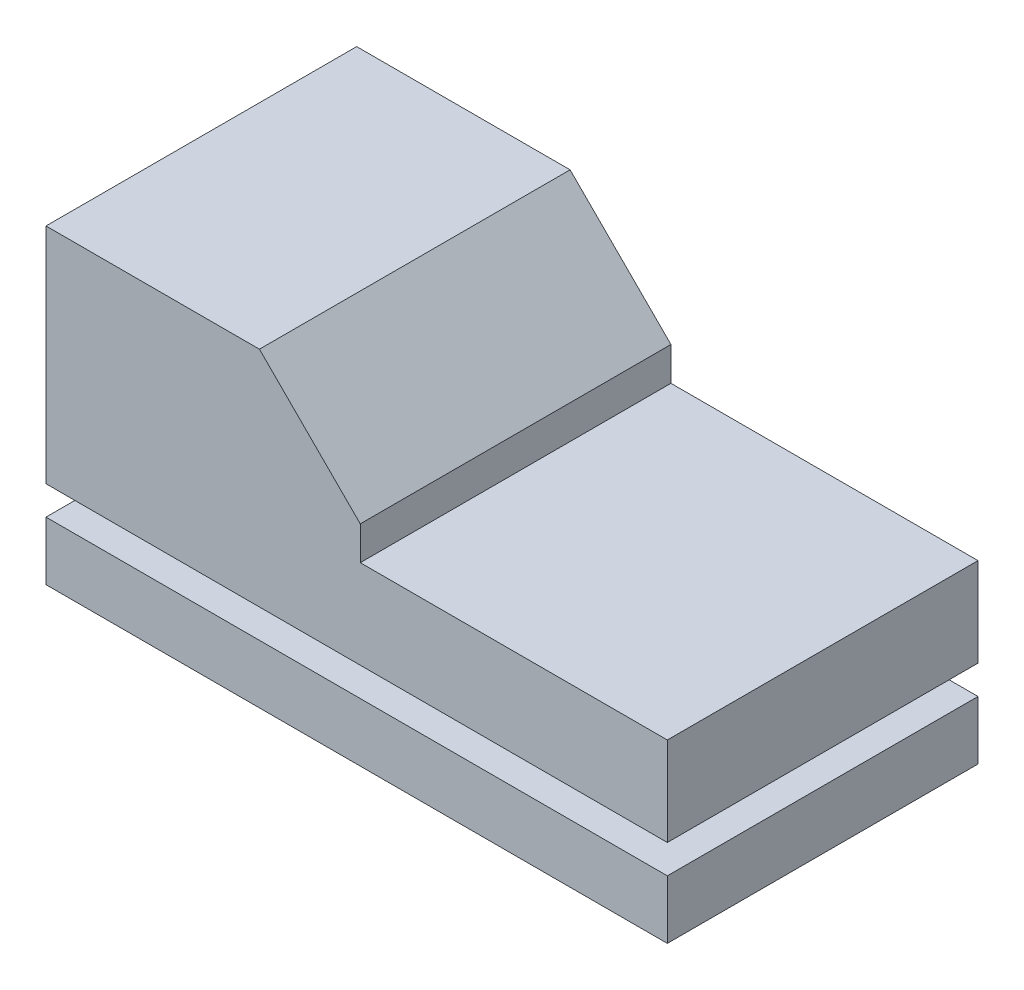
ISO-10303-21;
HEADER;
FILE_DESCRIPTION(('STEP AP214'),'2;1');
FILE_NAME('part.step','',(''),(''),'','','');
FILE_SCHEMA(('AUTOMOTIVE_DESIGN { 1 0 10303 214 1 1 1 1 }'));
ENDSEC;
DATA;
#1=APPLICATION_CONTEXT('core data for automotive mechanical design processes');
#2=APPLICATION_PROTOCOL_DEFINITION('international standard','automotive_design',2000,#1);
#3=PRODUCT_CONTEXT('',#1,'mechanical');
#4=PRODUCT('Part','Part','',(#3));
#5=PRODUCT_RELATED_PRODUCT_CATEGORY('part','',(#4));
#6=PRODUCT_DEFINITION_FORMATION('','',#4);
#7=PRODUCT_DEFINITION_CONTEXT('part definition',#1,'design');
#8=PRODUCT_DEFINITION('design','',#6,#7);
#9=PRODUCT_DEFINITION_SHAPE('','',#8);
#10=(LENGTH_UNIT() NAMED_UNIT(*) SI_UNIT(.MILLI.,.METRE.));
#11=(NAMED_UNIT(*) PLANE_ANGLE_UNIT() SI_UNIT($,.RADIAN.));
#12=(NAMED_UNIT(*) SI_UNIT($,.STERADIAN.) SOLID_ANGLE_UNIT());
#13=UNCERTAINTY_MEASURE_WITH_UNIT(LENGTH_MEASURE(1.E-05),#10,'distance_accuracy_value','');
#14=(GEOMETRIC_REPRESENTATION_CONTEXT(3) GLOBAL_UNCERTAINTY_ASSIGNED_CONTEXT((#13)) GLOBAL_UNIT_ASSIGNED_CONTEXT((#10,
#11,#12)) REPRESENTATION_CONTEXT('',''));
#15=CARTESIAN_POINT('',(0.,0.,0.));
#16=DIRECTION('',(0.,0.,1.));
#17=DIRECTION('',(1.,0.,0.));
#18=AXIS2_PLACEMENT_3D('',#15,#16,#17);
#19=CARTESIAN_POINT('',(101.6,28.81,25.4));
#20=DIRECTION('',(-1.,0.,0.));
#21=DIRECTION('',(0.,0.,1.));
#22=AXIS2_PLACEMENT_3D('',#19,#20,#21);
#23=PLANE('',#22);
#24=DIRECTION('',(0.,1.,0.));
#25=VECTOR('',#24,1.);
#26=CARTESIAN_POINT('',(101.6,28.81,25.4));
#27=LINE('',#26,#25);
#28=CARTESIAN_POINT('',(101.6,14.29,25.4));
#29=VERTEX_POINT('',#28);
#30=CARTESIAN_POINT('',(101.6,28.81,25.4));
#31=VERTEX_POINT('',#30);
#32=EDGE_CURVE('E255',#29,#31,#27,.T.);
#33=ORIENTED_EDGE('',*,*,#32,.F.);
#34=DIRECTION('',(0.,0.,1.));
#35=VECTOR('',#34,1.);
#36=CARTESIAN_POINT('',(101.6,14.29,-25.4));
#37=LINE('',#36,#35);
#38=CARTESIAN_POINT('',(101.6,14.29,-25.4));
#39=VERTEX_POINT('',#38);
#40=EDGE_CURVE('E240',#39,#29,#37,.T.);
#41=ORIENTED_EDGE('',*,*,#40,.F.);
#42=DIRECTION('',(0.,1.,0.));
#43=VECTOR('',#42,1.);
#44=CARTESIAN_POINT('',(101.6,28.81,-25.4));
#45=LINE('',#44,#43);
#46=CARTESIAN_POINT('',(101.6,28.81,-25.4));
#47=VERTEX_POINT('',#46);
#48=EDGE_CURVE('E275',#39,#47,#45,.T.);
#49=ORIENTED_EDGE('',*,*,#48,.T.);
#50=DIRECTION('',(0.,0.,-1.));
#51=VECTOR('',#50,1.);
#52=CARTESIAN_POINT('',(101.6,28.81,25.4));
#53=LINE('',#52,#51);
#54=EDGE_CURVE('E41',#31,#47,#53,.T.);
#55=ORIENTED_EDGE('',*,*,#54,.F.);
#56=EDGE_LOOP('',(#33,#41,#49,#55));
#57=FACE_BOUND('',#56,.T.);
#58=ADVANCED_FACE('F33',(#57),#23,.F.);
#59=CARTESIAN_POINT('',(51.39,28.81,25.4));
#60=DIRECTION('',(0.,-1.,0.));
#61=DIRECTION('',(1.,0.,0.));
#62=AXIS2_PLACEMENT_3D('',#59,#60,#61);
#63=PLANE('',#62);
#64=DIRECTION('',(-1.,0.,0.));
#65=VECTOR('',#64,1.);
#66=CARTESIAN_POINT('',(51.39,28.81,-25.4));
#67=LINE('',#66,#65);
#68=CARTESIAN_POINT('',(51.39,28.81,-25.4));
#69=VERTEX_POINT('',#68);
#70=EDGE_CURVE('E279',#47,#69,#67,.T.);
#71=ORIENTED_EDGE('',*,*,#70,.T.);
#72=DIRECTION('',(0.,0.,-1.));
#73=VECTOR('',#72,1.);
#74=CARTESIAN_POINT('',(51.39,28.81,25.4));
#75=LINE('',#74,#73);
#76=CARTESIAN_POINT('',(51.39,28.81,25.4));
#77=VERTEX_POINT('',#76);
#78=EDGE_CURVE('E301',#77,#69,#75,.T.);
#79=ORIENTED_EDGE('',*,*,#78,.F.);
#80=DIRECTION('',(-1.,0.,0.));
#81=VECTOR('',#80,1.);
#82=CARTESIAN_POINT('',(51.39,28.81,25.4));
#83=LINE('',#82,#81);
#84=EDGE_CURVE('E260',#31,#77,#83,.T.);
#85=ORIENTED_EDGE('',*,*,#84,.F.);
#86=ORIENTED_EDGE('',*,*,#54,.T.);
#87=EDGE_LOOP('',(#71,#79,#85,#86));
#88=FACE_BOUND('',#87,.T.);
#89=ADVANCED_FACE('F308',(#88),#63,.F.);
#90=CARTESIAN_POINT('',(51.39,34.31,25.4));
#91=DIRECTION('',(-1.,0.,0.));
#92=DIRECTION('',(0.,0.,1.));
#93=AXIS2_PLACEMENT_3D('',#90,#91,#92);
#94=PLANE('',#93);
#95=DIRECTION('',(0.,1.,0.));
#96=VECTOR('',#95,1.);
#97=CARTESIAN_POINT('',(51.39,34.31,-25.4));
#98=LINE('',#97,#96);
#99=CARTESIAN_POINT('',(51.39,34.31,-25.4));
#100=VERTEX_POINT('',#99);
#101=EDGE_CURVE('E281',#69,#100,#98,.T.);
#102=ORIENTED_EDGE('',*,*,#101,.T.);
#103=DIRECTION('',(0.,0.,-1.));
#104=VECTOR('',#103,1.);
#105=CARTESIAN_POINT('',(51.39,34.31,25.4));
#106=LINE('',#105,#104);
#107=CARTESIAN_POINT('',(51.39,34.31,25.4));
#108=VERTEX_POINT('',#107);
#109=EDGE_CURVE('E298',#108,#100,#106,.T.);
#110=ORIENTED_EDGE('',*,*,#109,.F.);
#111=DIRECTION('',(0.,1.,0.));
#112=VECTOR('',#111,1.);
#113=CARTESIAN_POINT('',(51.39,34.31,25.4));
#114=LINE('',#113,#112);
#115=EDGE_CURVE('E262',#77,#108,#114,.T.);
#116=ORIENTED_EDGE('',*,*,#115,.F.);
#117=ORIENTED_EDGE('',*,*,#78,.T.);
#118=EDGE_LOOP('',(#102,#110,#116,#117));
#119=FACE_BOUND('',#118,.T.);
#120=ADVANCED_FACE('F321',(#119),#94,.F.);
#121=CARTESIAN_POINT('',(34.9,50.8,25.4));
#122=DIRECTION('',(-0.707106781186549,-0.707106781186546,0.));
#123=DIRECTION('',(0.707106781186546,-0.707106781186549,0.));
#124=AXIS2_PLACEMENT_3D('',#121,#122,#123);
#125=PLANE('',#124);
#126=DIRECTION('',(-0.707106781186546,0.707106781186549,0.));
#127=VECTOR('',#126,1.);
#128=CARTESIAN_POINT('',(34.9,50.8,-25.4));
#129=LINE('',#128,#127);
#130=CARTESIAN_POINT('',(34.9,50.8,-25.4));
#131=VERTEX_POINT('',#130);
#132=EDGE_CURVE('E283',#100,#131,#129,.T.);
#133=ORIENTED_EDGE('',*,*,#132,.T.);
#134=DIRECTION('',(0.,0.,-1.));
#135=VECTOR('',#134,1.);
#136=CARTESIAN_POINT('',(34.9,50.8,25.4));
#137=LINE('',#136,#135);
#138=CARTESIAN_POINT('',(34.9,50.8,25.4));
#139=VERTEX_POINT('',#138);
#140=EDGE_CURVE('E295',#139,#131,#137,.T.);
#141=ORIENTED_EDGE('',*,*,#140,.F.);
#142=DIRECTION('',(-0.707106781186546,0.707106781186549,0.));
#143=VECTOR('',#142,1.);
#144=CARTESIAN_POINT('',(34.9,50.8,25.4));
#145=LINE('',#144,#143);
#146=EDGE_CURVE('E264',#108,#139,#145,.T.);
#147=ORIENTED_EDGE('',*,*,#146,.F.);
#148=ORIENTED_EDGE('',*,*,#109,.T.);
#149=EDGE_LOOP('',(#133,#141,#147,#148));
#150=FACE_BOUND('',#149,.T.);
#151=ADVANCED_FACE('F325',(#150),#125,.F.);
#152=CARTESIAN_POINT('',(0.,50.8,25.4));
#153=DIRECTION('',(0.,-1.,0.));
#154=DIRECTION('',(0.,0.,-1.));
#155=AXIS2_PLACEMENT_3D('',#152,#153,#154);
#156=PLANE('',#155);
#157=DIRECTION('',(-1.,0.,0.));
#158=VECTOR('',#157,1.);
#159=CARTESIAN_POINT('',(0.,50.8,-25.4));
#160=LINE('',#159,#158);
#161=CARTESIAN_POINT('',(0.,50.8,-25.4));
#162=VERTEX_POINT('',#161);
#163=EDGE_CURVE('E285',#131,#162,#160,.T.);
#164=ORIENTED_EDGE('',*,*,#163,.T.);
#165=DIRECTION('',(0.,0.,-1.));
#166=VECTOR('',#165,1.);
#167=CARTESIAN_POINT('',(0.,50.8,25.4));
#168=LINE('',#167,#166);
#169=CARTESIAN_POINT('',(0.,50.8,25.4));
#170=VERTEX_POINT('',#169);
#171=EDGE_CURVE('E292',#170,#162,#168,.T.);
#172=ORIENTED_EDGE('',*,*,#171,.F.);
#173=DIRECTION('',(-1.,0.,0.));
#174=VECTOR('',#173,1.);
#175=CARTESIAN_POINT('',(0.,50.8,25.4));
#176=LINE('',#175,#174);
#177=EDGE_CURVE('E266',#139,#170,#176,.T.);
#178=ORIENTED_EDGE('',*,*,#177,.F.);
#179=ORIENTED_EDGE('',*,*,#140,.T.);
#180=EDGE_LOOP('',(#164,#172,#178,#179));
#181=FACE_BOUND('',#180,.T.);
#182=ADVANCED_FACE('F341',(#181),#156,.F.);
#183=CARTESIAN_POINT('',(0.,0.,25.4));
#184=DIRECTION('',(1.,0.,0.));
#185=DIRECTION('',(0.,0.,-1.));
#186=AXIS2_PLACEMENT_3D('',#183,#184,#185);
#187=PLANE('',#186);
#188=DIRECTION('',(0.,-1.,0.));
#189=VECTOR('',#188,1.);
#190=CARTESIAN_POINT('',(0.,0.,-25.4));
#191=LINE('',#190,#189);
#192=CARTESIAN_POINT('',(0.,14.29,-25.4));
#193=VERTEX_POINT('',#192);
#194=EDGE_CURVE('E256',#162,#193,#191,.T.);
#195=ORIENTED_EDGE('',*,*,#194,.T.);
#196=DIRECTION('',(0.,0.,-1.));
#197=VECTOR('',#196,1.);
#198=CARTESIAN_POINT('',(0.,14.29,-25.4));
#199=LINE('',#198,#197);
#200=CARTESIAN_POINT('',(0.,14.29,25.4));
#201=VERTEX_POINT('',#200);
#202=EDGE_CURVE('E235',#201,#193,#199,.T.);
#203=ORIENTED_EDGE('',*,*,#202,.F.);
#204=DIRECTION('',(0.,-1.,0.));
#205=VECTOR('',#204,1.);
#206=CARTESIAN_POINT('',(0.,0.,25.4));
#207=LINE('',#206,#205);
#208=EDGE_CURVE('E269',#170,#201,#207,.T.);
#209=ORIENTED_EDGE('',*,*,#208,.F.);
#210=ORIENTED_EDGE('',*,*,#171,.T.);
#211=EDGE_LOOP('',(#195,#203,#209,#210));
#212=FACE_BOUND('',#211,.T.);
#213=ADVANCED_FACE('F338',(#212),#187,.F.);
#214=CARTESIAN_POINT('',(0.,0.,25.4));
#215=DIRECTION('',(0.,0.,-1.));
#216=DIRECTION('',(-1.,0.,0.));
#217=AXIS2_PLACEMENT_3D('',#214,#215,#216);
#218=PLANE('',#217);
#219=ORIENTED_EDGE('',*,*,#208,.T.);
#220=DIRECTION('',(-1.,0.,0.));
#221=VECTOR('',#220,1.);
#222=CARTESIAN_POINT('',(0.,14.29,25.4));
#223=LINE('',#222,#221);
#224=EDGE_CURVE('E242',#29,#201,#223,.T.);
#225=ORIENTED_EDGE('',*,*,#224,.F.);
#226=ORIENTED_EDGE('',*,*,#32,.T.);
#227=ORIENTED_EDGE('',*,*,#84,.T.);
#228=ORIENTED_EDGE('',*,*,#115,.T.);
#229=ORIENTED_EDGE('',*,*,#146,.T.);
#230=ORIENTED_EDGE('',*,*,#177,.T.);
#231=EDGE_LOOP('',(#219,#225,#226,#227,#228,#229,#230));
#232=FACE_BOUND('',#231,.T.);
#233=ADVANCED_FACE('F329',(#232),#218,.F.);
#234=CARTESIAN_POINT('',(0.,0.,-25.4));
#235=DIRECTION('',(0.,0.,-1.));
#236=DIRECTION('',(-1.,0.,0.));
#237=AXIS2_PLACEMENT_3D('',#234,#235,#236);
#238=PLANE('',#237);
#239=DIRECTION('',(1.,0.,0.));
#240=VECTOR('',#239,1.);
#241=CARTESIAN_POINT('',(0.,14.29,-25.4));
#242=LINE('',#241,#240);
#243=EDGE_CURVE('E237',#193,#39,#242,.T.);
#244=ORIENTED_EDGE('',*,*,#243,.F.);
#245=ORIENTED_EDGE('',*,*,#194,.F.);
#246=ORIENTED_EDGE('',*,*,#163,.F.);
#247=ORIENTED_EDGE('',*,*,#132,.F.);
#248=ORIENTED_EDGE('',*,*,#101,.F.);
#249=ORIENTED_EDGE('',*,*,#70,.F.);
#250=ORIENTED_EDGE('',*,*,#48,.F.);
#251=EDGE_LOOP('',(#244,#245,#246,#247,#248,#249,#250));
#252=FACE_BOUND('',#251,.T.);
#253=ADVANCED_FACE('F316',(#252),#238,.T.);
#254=CARTESIAN_POINT('',(0.,14.29,0.));
#255=DIRECTION('',(0.,1.,0.));
#256=DIRECTION('',(0.,0.,1.));
#257=AXIS2_PLACEMENT_3D('',#254,#255,#256);
#258=PLANE('',#257);
#259=DIRECTION('',(0.,0.,-1.));
#260=VECTOR('',#259,1.);
#261=CARTESIAN_POINT('',(5.36,14.29,-20.04));
#262=LINE('',#261,#260);
#263=CARTESIAN_POINT('',(5.35999999999999,14.29,20.04));
#264=VERTEX_POINT('',#263);
#265=CARTESIAN_POINT('',(5.36,14.29,-20.04));
#266=VERTEX_POINT('',#265);
#267=EDGE_CURVE('E203',#264,#266,#262,.T.);
#268=ORIENTED_EDGE('',*,*,#267,.F.);
#269=DIRECTION('',(-1.,0.,0.));
#270=VECTOR('',#269,1.);
#271=CARTESIAN_POINT('',(5.35999999999999,14.29,20.04));
#272=LINE('',#271,#270);
#273=CARTESIAN_POINT('',(96.24,14.29,20.04));
#274=VERTEX_POINT('',#273);
#275=EDGE_CURVE('E213',#274,#264,#272,.T.);
#276=ORIENTED_EDGE('',*,*,#275,.F.);
#277=DIRECTION('',(0.,0.,1.));
#278=VECTOR('',#277,1.);
#279=CARTESIAN_POINT('',(96.24,14.29,-20.04));
#280=LINE('',#279,#278);
#281=CARTESIAN_POINT('',(96.24,14.29,-20.04));
#282=VERTEX_POINT('',#281);
#283=EDGE_CURVE('E210',#282,#274,#280,.T.);
#284=ORIENTED_EDGE('',*,*,#283,.F.);
#285=DIRECTION('',(1.,0.,0.));
#286=VECTOR('',#285,1.);
#287=CARTESIAN_POINT('',(5.36,14.29,-20.04));
#288=LINE('',#287,#286);
#289=EDGE_CURVE('E206',#266,#282,#288,.T.);
#290=ORIENTED_EDGE('',*,*,#289,.F.);
#291=EDGE_LOOP('',(#268,#276,#284,#290));
#292=FACE_BOUND('',#291,.T.);
#293=ORIENTED_EDGE('',*,*,#202,.T.);
#294=ORIENTED_EDGE('',*,*,#243,.T.);
#295=ORIENTED_EDGE('',*,*,#40,.T.);
#296=ORIENTED_EDGE('',*,*,#224,.T.);
#297=EDGE_LOOP('',(#293,#294,#295,#296));
#298=FACE_BOUND('',#297,.T.);
#299=ADVANCED_FACE('F334',(#292,#298),#258,.F.);
#300=CARTESIAN_POINT('',(0.,9.57,0.));
#301=DIRECTION('',(0.,1.,0.));
#302=DIRECTION('',(0.,0.,1.));
#303=AXIS2_PLACEMENT_3D('',#300,#301,#302);
#304=PLANE('',#303);
#305=DIRECTION('',(1.,0.,0.));
#306=VECTOR('',#305,1.);
#307=CARTESIAN_POINT('',(5.36,9.57,-20.04));
#308=LINE('',#307,#306);
#309=CARTESIAN_POINT('',(5.36,9.57,-20.04));
#310=VERTEX_POINT('',#309);
#311=CARTESIAN_POINT('',(96.24,9.57,-20.04));
#312=VERTEX_POINT('',#311);
#313=EDGE_CURVE('E218',#310,#312,#308,.T.);
#314=ORIENTED_EDGE('',*,*,#313,.T.);
#315=DIRECTION('',(0.,0.,1.));
#316=VECTOR('',#315,1.);
#317=CARTESIAN_POINT('',(96.24,9.57,-20.04));
#318=LINE('',#317,#316);
#319=CARTESIAN_POINT('',(96.24,9.57,20.04));
#320=VERTEX_POINT('',#319);
#321=EDGE_CURVE('E221',#312,#320,#318,.T.);
#322=ORIENTED_EDGE('',*,*,#321,.T.);
#323=DIRECTION('',(-1.,0.,0.));
#324=VECTOR('',#323,1.);
#325=CARTESIAN_POINT('',(5.35999999999999,9.57,20.04));
#326=LINE('',#325,#324);
#327=CARTESIAN_POINT('',(5.35999999999999,9.57,20.04));
#328=VERTEX_POINT('',#327);
#329=EDGE_CURVE('E207',#320,#328,#326,.T.);
#330=ORIENTED_EDGE('',*,*,#329,.T.);
#331=DIRECTION('',(0.,0.,-1.));
#332=VECTOR('',#331,1.);
#333=CARTESIAN_POINT('',(5.36,9.57,-20.04));
#334=LINE('',#333,#332);
#335=EDGE_CURVE('E199',#328,#310,#334,.T.);
#336=ORIENTED_EDGE('',*,*,#335,.T.);
#337=EDGE_LOOP('',(#314,#322,#330,#336));
#338=FACE_BOUND('',#337,.T.);
#339=DIRECTION('',(0.,0.,-1.));
#340=VECTOR('',#339,1.);
#341=CARTESIAN_POINT('',(0.,9.57,-25.4));
#342=LINE('',#341,#340);
#343=CARTESIAN_POINT('',(0.,9.57,25.4));
#344=VERTEX_POINT('',#343);
#345=CARTESIAN_POINT('',(0.,9.57,-25.4));
#346=VERTEX_POINT('',#345);
#347=EDGE_CURVE('E228',#344,#346,#342,.T.);
#348=ORIENTED_EDGE('',*,*,#347,.F.);
#349=DIRECTION('',(-1.,0.,0.));
#350=VECTOR('',#349,1.);
#351=CARTESIAN_POINT('',(0.,9.57,25.4));
#352=LINE('',#351,#350);
#353=CARTESIAN_POINT('',(101.6,9.57,25.4));
#354=VERTEX_POINT('',#353);
#355=EDGE_CURVE('E238',#354,#344,#352,.T.);
#356=ORIENTED_EDGE('',*,*,#355,.F.);
#357=DIRECTION('',(0.,0.,1.));
#358=VECTOR('',#357,1.);
#359=CARTESIAN_POINT('',(101.6,9.57,-25.4));
#360=LINE('',#359,#358);
#361=CARTESIAN_POINT('',(101.6,9.57,-25.4));
#362=VERTEX_POINT('',#361);
#363=EDGE_CURVE('E56',#362,#354,#360,.T.);
#364=ORIENTED_EDGE('',*,*,#363,.F.);
#365=DIRECTION('',(1.,0.,0.));
#366=VECTOR('',#365,1.);
#367=CARTESIAN_POINT('',(0.,9.57,-25.4));
#368=LINE('',#367,#366);
#369=EDGE_CURVE('E247',#346,#362,#368,.T.);
#370=ORIENTED_EDGE('',*,*,#369,.F.);
#371=EDGE_LOOP('',(#348,#356,#364,#370));
#372=FACE_BOUND('',#371,.T.);
#373=ADVANCED_FACE('F377',(#338,#372),#304,.T.);
#374=CARTESIAN_POINT('',(5.36,14.29,-20.04));
#375=DIRECTION('',(-1.,0.,0.));
#376=DIRECTION('',(0.,0.,1.));
#377=AXIS2_PLACEMENT_3D('',#374,#375,#376);
#378=PLANE('',#377);
#379=ORIENTED_EDGE('',*,*,#335,.F.);
#380=DIRECTION('',(0.,-1.,0.));
#381=VECTOR('',#380,1.);
#382=CARTESIAN_POINT('',(5.35999999999999,14.29,20.04));
#383=LINE('',#382,#381);
#384=EDGE_CURVE('E226',#264,#328,#383,.T.);
#385=ORIENTED_EDGE('',*,*,#384,.F.);
#386=ORIENTED_EDGE('',*,*,#267,.T.);
#387=DIRECTION('',(0.,-1.,0.));
#388=VECTOR('',#387,1.);
#389=CARTESIAN_POINT('',(5.36,14.29,-20.04));
#390=LINE('',#389,#388);
#391=EDGE_CURVE('E216',#266,#310,#390,.T.);
#392=ORIENTED_EDGE('',*,*,#391,.T.);
#393=EDGE_LOOP('',(#379,#385,#386,#392));
#394=FACE_BOUND('',#393,.T.);
#395=ADVANCED_FACE('F379',(#394),#378,.T.);
#396=CARTESIAN_POINT('',(5.35999999999999,14.29,20.04));
#397=DIRECTION('',(0.,0.,1.));
#398=DIRECTION('',(1.,0.,0.));
#399=AXIS2_PLACEMENT_3D('',#396,#397,#398);
#400=PLANE('',#399);
#401=ORIENTED_EDGE('',*,*,#329,.F.);
#402=DIRECTION('',(0.,-1.,0.));
#403=VECTOR('',#402,1.);
#404=CARTESIAN_POINT('',(96.24,14.29,20.04));
#405=LINE('',#404,#403);
#406=EDGE_CURVE('E229',#274,#320,#405,.T.);
#407=ORIENTED_EDGE('',*,*,#406,.F.);
#408=ORIENTED_EDGE('',*,*,#275,.T.);
#409=ORIENTED_EDGE('',*,*,#384,.T.);
#410=EDGE_LOOP('',(#401,#407,#408,#409));
#411=FACE_BOUND('',#410,.T.);
#412=ADVANCED_FACE('F386',(#411),#400,.T.);
#413=CARTESIAN_POINT('',(96.24,14.29,-20.04));
#414=DIRECTION('',(1.,0.,0.));
#415=DIRECTION('',(0.,0.,-1.));
#416=AXIS2_PLACEMENT_3D('',#413,#414,#415);
#417=PLANE('',#416);
#418=ORIENTED_EDGE('',*,*,#321,.F.);
#419=DIRECTION('',(0.,-1.,0.));
#420=VECTOR('',#419,1.);
#421=CARTESIAN_POINT('',(96.24,14.29,-20.04));
#422=LINE('',#421,#420);
#423=EDGE_CURVE('E231',#282,#312,#422,.T.);
#424=ORIENTED_EDGE('',*,*,#423,.F.);
#425=ORIENTED_EDGE('',*,*,#283,.T.);
#426=ORIENTED_EDGE('',*,*,#406,.T.);
#427=EDGE_LOOP('',(#418,#424,#425,#426));
#428=FACE_BOUND('',#427,.T.);
#429=ADVANCED_FACE('F409',(#428),#417,.T.);
#430=CARTESIAN_POINT('',(5.36,14.29,-20.04));
#431=DIRECTION('',(0.,0.,-1.));
#432=DIRECTION('',(-1.,0.,0.));
#433=AXIS2_PLACEMENT_3D('',#430,#431,#432);
#434=PLANE('',#433);
#435=ORIENTED_EDGE('',*,*,#313,.F.);
#436=ORIENTED_EDGE('',*,*,#391,.F.);
#437=ORIENTED_EDGE('',*,*,#289,.T.);
#438=ORIENTED_EDGE('',*,*,#423,.T.);
#439=EDGE_LOOP('',(#435,#436,#437,#438));
#440=FACE_BOUND('',#439,.T.);
#441=ADVANCED_FACE('F404',(#440),#434,.T.);
#442=CARTESIAN_POINT('',(101.6,0.,25.4));
#443=DIRECTION('',(0.,1.,0.));
#444=DIRECTION('',(-1.,0.,0.));
#445=AXIS2_PLACEMENT_3D('',#442,#443,#444);
#446=PLANE('',#445);
#447=DIRECTION('',(1.,0.,0.));
#448=VECTOR('',#447,1.);
#449=CARTESIAN_POINT('',(9.,0.,-15.));
#450=LINE('',#449,#448);
#451=CARTESIAN_POINT('',(9.00000000000001,0.,-15.));
#452=VERTEX_POINT('',#451);
#453=CARTESIAN_POINT('',(91.6,0.,-15.));
#454=VERTEX_POINT('',#453);
#455=EDGE_CURVE('E193',#452,#454,#450,.T.);
#456=ORIENTED_EDGE('',*,*,#455,.F.);
#457=DIRECTION('',(0.,0.,-1.));
#458=VECTOR('',#457,1.);
#459=CARTESIAN_POINT('',(9.,0.,15.));
#460=LINE('',#459,#458);
#461=CARTESIAN_POINT('',(9.,0.,15.));
#462=VERTEX_POINT('',#461);
#463=EDGE_CURVE('E48',#462,#452,#460,.T.);
#464=ORIENTED_EDGE('',*,*,#463,.F.);
#465=DIRECTION('',(-1.,0.,0.));
#466=VECTOR('',#465,1.);
#467=CARTESIAN_POINT('',(9.,0.,15.));
#468=LINE('',#467,#466);
#469=CARTESIAN_POINT('',(91.6,0.,15.));
#470=VERTEX_POINT('',#469);
#471=EDGE_CURVE('E184',#470,#462,#468,.T.);
#472=ORIENTED_EDGE('',*,*,#471,.F.);
#473=DIRECTION('',(0.,0.,1.));
#474=VECTOR('',#473,1.);
#475=CARTESIAN_POINT('',(91.6,0.,15.));
#476=LINE('',#475,#474);
#477=EDGE_CURVE('E187',#454,#470,#476,.T.);
#478=ORIENTED_EDGE('',*,*,#477,.F.);
#479=EDGE_LOOP('',(#456,#464,#472,#478));
#480=FACE_BOUND('',#479,.T.);
#481=DIRECTION('',(1.,0.,0.));
#482=VECTOR('',#481,1.);
#483=CARTESIAN_POINT('',(101.6,0.,-25.4));
#484=LINE('',#483,#482);
#485=CARTESIAN_POINT('',(0.,0.,-25.4));
#486=VERTEX_POINT('',#485);
#487=CARTESIAN_POINT('',(101.6,0.,-25.4));
#488=VERTEX_POINT('',#487);
#489=EDGE_CURVE('E244',#486,#488,#484,.T.);
#490=ORIENTED_EDGE('',*,*,#489,.T.);
#491=DIRECTION('',(0.,0.,-1.));
#492=VECTOR('',#491,1.);
#493=CARTESIAN_POINT('',(101.6,0.,25.4));
#494=LINE('',#493,#492);
#495=CARTESIAN_POINT('',(101.6,0.,25.4));
#496=VERTEX_POINT('',#495);
#497=EDGE_CURVE('E11',#496,#488,#494,.T.);
#498=ORIENTED_EDGE('',*,*,#497,.F.);
#499=DIRECTION('',(1.,0.,0.));
#500=VECTOR('',#499,1.);
#501=CARTESIAN_POINT('',(101.6,0.,25.4));
#502=LINE('',#501,#500);
#503=CARTESIAN_POINT('',(0.,0.,25.4));
#504=VERTEX_POINT('',#503);
#505=EDGE_CURVE('E252',#504,#496,#502,.T.);
#506=ORIENTED_EDGE('',*,*,#505,.F.);
#507=DIRECTION('',(0.,0.,-1.));
#508=VECTOR('',#507,1.);
#509=CARTESIAN_POINT('',(0.,0.,25.4));
#510=LINE('',#509,#508);
#511=EDGE_CURVE('E272',#504,#486,#510,.T.);
#512=ORIENTED_EDGE('',*,*,#511,.T.);
#513=EDGE_LOOP('',(#490,#498,#506,#512));
#514=FACE_BOUND('',#513,.T.);
#515=ADVANCED_FACE('F35',(#480,#514),#446,.F.);
#516=ORIENTED_EDGE('',*,*,#355,.T.);
#517=EDGE_CURVE('E268',#344,#504,#207,.T.);
#518=ORIENTED_EDGE('',*,*,#517,.T.);
#519=ORIENTED_EDGE('',*,*,#505,.T.);
#520=EDGE_CURVE('E257',#496,#354,#27,.T.);
#521=ORIENTED_EDGE('',*,*,#520,.T.);
#522=EDGE_LOOP('',(#516,#518,#519,#521));
#523=FACE_BOUND('',#522,.T.);
#524=ADVANCED_FACE('F368',(#523),#218,.F.);
#525=EDGE_CURVE('E287',#346,#486,#191,.T.);
#526=ORIENTED_EDGE('',*,*,#525,.F.);
#527=ORIENTED_EDGE('',*,*,#369,.T.);
#528=EDGE_CURVE('E276',#488,#362,#45,.T.);
#529=ORIENTED_EDGE('',*,*,#528,.F.);
#530=ORIENTED_EDGE('',*,*,#489,.F.);
#531=EDGE_LOOP('',(#526,#527,#529,#530));
#532=FACE_BOUND('',#531,.T.);
#533=ADVANCED_FACE('F365',(#532),#238,.T.);
#534=ORIENTED_EDGE('',*,*,#347,.T.);
#535=ORIENTED_EDGE('',*,*,#525,.T.);
#536=ORIENTED_EDGE('',*,*,#511,.F.);
#537=ORIENTED_EDGE('',*,*,#517,.F.);
#538=EDGE_LOOP('',(#534,#535,#536,#537));
#539=FACE_BOUND('',#538,.T.);
#540=ADVANCED_FACE('F349',(#539),#187,.F.);
#541=ORIENTED_EDGE('',*,*,#363,.T.);
#542=ORIENTED_EDGE('',*,*,#520,.F.);
#543=ORIENTED_EDGE('',*,*,#497,.T.);
#544=ORIENTED_EDGE('',*,*,#528,.T.);
#545=EDGE_LOOP('',(#541,#542,#543,#544));
#546=FACE_BOUND('',#545,.T.);
#547=ADVANCED_FACE('F352',(#546),#23,.F.);
#548=CARTESIAN_POINT('',(9.,8.43,15.));
#549=DIRECTION('',(-1.,0.,0.));
#550=DIRECTION('',(0.,0.,1.));
#551=AXIS2_PLACEMENT_3D('',#548,#549,#550);
#552=PLANE('',#551);
#553=ORIENTED_EDGE('',*,*,#463,.T.);
#554=DIRECTION('',(0.,-1.,0.));
#555=VECTOR('',#554,1.);
#556=CARTESIAN_POINT('',(9.,8.43,-15.));
#557=LINE('',#556,#555);
#558=CARTESIAN_POINT('',(9.,8.43,-15.));
#559=VERTEX_POINT('',#558);
#560=EDGE_CURVE('E162',#559,#452,#557,.T.);
#561=ORIENTED_EDGE('',*,*,#560,.F.);
#562=DIRECTION('',(0.,0.,-1.));
#563=VECTOR('',#562,1.);
#564=CARTESIAN_POINT('',(9.,8.43,15.));
#565=LINE('',#564,#563);
#566=CARTESIAN_POINT('',(9.,8.43,15.));
#567=VERTEX_POINT('',#566);
#568=EDGE_CURVE('E166',#567,#559,#565,.T.);
#569=ORIENTED_EDGE('',*,*,#568,.F.);
#570=DIRECTION('',(0.,-1.,0.));
#571=VECTOR('',#570,1.);
#572=CARTESIAN_POINT('',(9.,8.43,15.));
#573=LINE('',#572,#571);
#574=EDGE_CURVE('E197',#567,#462,#573,.T.);
#575=ORIENTED_EDGE('',*,*,#574,.T.);
#576=EDGE_LOOP('',(#553,#561,#569,#575));
#577=FACE_BOUND('',#576,.T.);
#578=ADVANCED_FACE('F164',(#577),#552,.F.);
#579=CARTESIAN_POINT('',(9.,8.43,15.));
#580=DIRECTION('',(0.,0.,1.));
#581=DIRECTION('',(1.,0.,0.));
#582=AXIS2_PLACEMENT_3D('',#579,#580,#581);
#583=PLANE('',#582);
#584=ORIENTED_EDGE('',*,*,#471,.T.);
#585=ORIENTED_EDGE('',*,*,#574,.F.);
#586=DIRECTION('',(-1.,0.,0.));
#587=VECTOR('',#586,1.);
#588=CARTESIAN_POINT('',(9.,8.43,15.));
#589=LINE('',#588,#587);
#590=CARTESIAN_POINT('',(91.6,8.43,15.));
#591=VERTEX_POINT('',#590);
#592=EDGE_CURVE('E172',#591,#567,#589,.T.);
#593=ORIENTED_EDGE('',*,*,#592,.F.);
#594=DIRECTION('',(0.,-1.,0.));
#595=VECTOR('',#594,1.);
#596=CARTESIAN_POINT('',(91.6,8.43,15.));
#597=LINE('',#596,#595);
#598=EDGE_CURVE('E200',#591,#470,#597,.T.);
#599=ORIENTED_EDGE('',*,*,#598,.T.);
#600=EDGE_LOOP('',(#584,#585,#593,#599));
#601=FACE_BOUND('',#600,.T.);
#602=ADVANCED_FACE('F363',(#601),#583,.F.);
#603=CARTESIAN_POINT('',(91.6,8.43,15.));
#604=DIRECTION('',(1.,0.,0.));
#605=DIRECTION('',(0.,0.,-1.));
#606=AXIS2_PLACEMENT_3D('',#603,#604,#605);
#607=PLANE('',#606);
#608=ORIENTED_EDGE('',*,*,#477,.T.);
#609=ORIENTED_EDGE('',*,*,#598,.F.);
#610=DIRECTION('',(0.,0.,1.));
#611=VECTOR('',#610,1.);
#612=CARTESIAN_POINT('',(91.6,8.43,15.));
#613=LINE('',#612,#611);
#614=CARTESIAN_POINT('',(91.6,8.43,-15.));
#615=VERTEX_POINT('',#614);
#616=EDGE_CURVE('E180',#615,#591,#613,.T.);
#617=ORIENTED_EDGE('',*,*,#616,.F.);
#618=DIRECTION('',(0.,-1.,0.));
#619=VECTOR('',#618,1.);
#620=CARTESIAN_POINT('',(91.6,8.43,-15.));
#621=LINE('',#620,#619);
#622=EDGE_CURVE('E171',#615,#454,#621,.T.);
#623=ORIENTED_EDGE('',*,*,#622,.T.);
#624=EDGE_LOOP('',(#608,#609,#617,#623));
#625=FACE_BOUND('',#624,.T.);
#626=ADVANCED_FACE('F415',(#625),#607,.F.);
#627=CARTESIAN_POINT('',(9.,8.43,-15.));
#628=DIRECTION('',(0.,0.,-1.));
#629=DIRECTION('',(-1.,0.,0.));
#630=AXIS2_PLACEMENT_3D('',#627,#628,#629);
#631=PLANE('',#630);
#632=ORIENTED_EDGE('',*,*,#455,.T.);
#633=ORIENTED_EDGE('',*,*,#622,.F.);
#634=DIRECTION('',(1.,0.,0.));
#635=VECTOR('',#634,1.);
#636=CARTESIAN_POINT('',(9.,8.43,-15.));
#637=LINE('',#636,#635);
#638=EDGE_CURVE('E175',#559,#615,#637,.T.);
#639=ORIENTED_EDGE('',*,*,#638,.F.);
#640=ORIENTED_EDGE('',*,*,#560,.T.);
#641=EDGE_LOOP('',(#632,#633,#639,#640));
#642=FACE_BOUND('',#641,.T.);
#643=ADVANCED_FACE('F176',(#642),#631,.F.);
#644=CARTESIAN_POINT('',(0.,8.43,0.));
#645=DIRECTION('',(0.,-1.,0.));
#646=DIRECTION('',(0.,0.,-1.));
#647=AXIS2_PLACEMENT_3D('',#644,#645,#646);
#648=PLANE('',#647);
#649=ORIENTED_EDGE('',*,*,#568,.T.);
#650=ORIENTED_EDGE('',*,*,#638,.T.);
#651=ORIENTED_EDGE('',*,*,#616,.T.);
#652=ORIENTED_EDGE('',*,*,#592,.T.);
#653=EDGE_LOOP('',(#649,#650,#651,#652));
#654=FACE_BOUND('',#653,.T.);
#655=ADVANCED_FACE('F182',(#654),#648,.T.);
#656=CLOSED_SHELL('',(#58,#89,#120,#151,#182,#213,#233,#253,#299,#373,#395,#412,#429,#441,#515,
#524,#533,#540,#547,#578,#602,#626,#643,#655));
#657=MANIFOLD_SOLID_BREP('B2',#656);
#658=ADVANCED_BREP_SHAPE_REPRESENTATION('',(#18,#657),#14);
#659=SHAPE_DEFINITION_REPRESENTATION(#9,#658);
ENDSEC;
END-ISO-10303-21;
